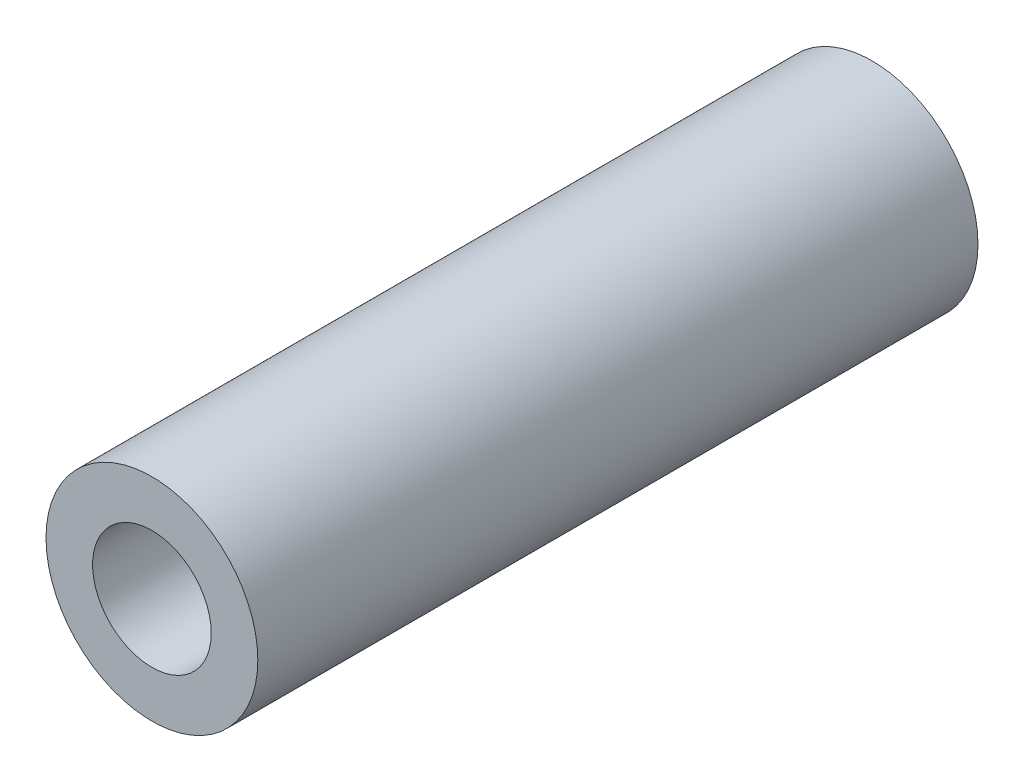
ISO-10303-21;
HEADER;
FILE_DESCRIPTION(('STEP AP214'),'2;1');
FILE_NAME('part.step','',(''),(''),'','','');
FILE_SCHEMA(('AUTOMOTIVE_DESIGN { 1 0 10303 214 1 1 1 1 }'));
ENDSEC;
DATA;
#1=APPLICATION_CONTEXT('core data for automotive mechanical design processes');
#2=APPLICATION_PROTOCOL_DEFINITION('international standard','automotive_design',2000,#1);
#3=PRODUCT_CONTEXT('',#1,'mechanical');
#4=PRODUCT('Part','Part','',(#3));
#5=PRODUCT_RELATED_PRODUCT_CATEGORY('part','',(#4));
#6=PRODUCT_DEFINITION_FORMATION('','',#4);
#7=PRODUCT_DEFINITION_CONTEXT('part definition',#1,'design');
#8=PRODUCT_DEFINITION('design','',#6,#7);
#9=PRODUCT_DEFINITION_SHAPE('','',#8);
#10=(LENGTH_UNIT() NAMED_UNIT(*) SI_UNIT(.MILLI.,.METRE.));
#11=(NAMED_UNIT(*) PLANE_ANGLE_UNIT() SI_UNIT($,.RADIAN.));
#12=(NAMED_UNIT(*) SI_UNIT($,.STERADIAN.) SOLID_ANGLE_UNIT());
#13=UNCERTAINTY_MEASURE_WITH_UNIT(LENGTH_MEASURE(1.E-05),#10,'distance_accuracy_value','');
#14=(GEOMETRIC_REPRESENTATION_CONTEXT(3) GLOBAL_UNCERTAINTY_ASSIGNED_CONTEXT((#13)) GLOBAL_UNIT_ASSIGNED_CONTEXT((#10,
#11,#12)) REPRESENTATION_CONTEXT('',''));
#15=CARTESIAN_POINT('',(0.,0.,0.));
#16=DIRECTION('',(0.,0.,1.));
#17=DIRECTION('',(1.,0.,0.));
#18=AXIS2_PLACEMENT_3D('',#15,#16,#17);
#19=CARTESIAN_POINT('',(100.,55.,139.));
#20=DIRECTION('',(0.,0.,1.));
#21=DIRECTION('',(1.,0.,0.));
#22=AXIS2_PLACEMENT_3D('',#19,#20,#21);
#23=CYLINDRICAL_SURFACE('',#22,2.8);
#24=DIRECTION('',(0.,0.,1.));
#25=VECTOR('',#24,1.);
#26=CARTESIAN_POINT('',(102.8,55.,139.));
#27=LINE('',#26,#25);
#28=CARTESIAN_POINT('',(102.8,55.,143.));
#29=VERTEX_POINT('',#28);
#30=CARTESIAN_POINT('',(102.8,55.,177.));
#31=VERTEX_POINT('',#30);
#32=EDGE_CURVE('E11',#29,#31,#27,.T.);
#33=ORIENTED_EDGE('',*,*,#32,.F.);
#34=CARTESIAN_POINT('',(100.,55.,143.));
#35=DIRECTION('',(0.,0.,1.));
#36=DIRECTION('',(1.,0.,0.));
#37=AXIS2_PLACEMENT_3D('',#34,#35,#36);
#38=CIRCLE('',#37,2.8);
#39=EDGE_CURVE('E24',#29,#29,#38,.T.);
#40=ORIENTED_EDGE('',*,*,#39,.F.);
#41=ORIENTED_EDGE('',*,*,#32,.T.);
#42=CARTESIAN_POINT('',(100.,55.,177.));
#43=DIRECTION('',(0.,0.,1.));
#44=DIRECTION('',(1.,0.,0.));
#45=AXIS2_PLACEMENT_3D('',#42,#43,#44);
#46=CIRCLE('',#45,2.8);
#47=EDGE_CURVE('E66',#31,#31,#46,.T.);
#48=ORIENTED_EDGE('',*,*,#47,.T.);
#49=EDGE_LOOP('',(#33,#40,#41,#48));
#50=FACE_BOUND('',#49,.T.);
#51=ADVANCED_FACE('F16',(#50),#23,.F.);
#52=CARTESIAN_POINT('',(100.,55.,143.));
#53=DIRECTION('',(0.,0.,1.));
#54=DIRECTION('',(1.,0.,0.));
#55=AXIS2_PLACEMENT_3D('',#52,#53,#54);
#56=PLANE('',#55);
#57=ORIENTED_EDGE('',*,*,#39,.T.);
#58=EDGE_LOOP('',(#57));
#59=FACE_BOUND('',#58,.T.);
#60=CARTESIAN_POINT('',(100.,55.,143.));
#61=DIRECTION('',(0.,0.,1.));
#62=DIRECTION('',(1.,0.,0.));
#63=AXIS2_PLACEMENT_3D('',#60,#61,#62);
#64=CIRCLE('',#63,5.);
#65=CARTESIAN_POINT('',(105.,55.,143.));
#66=VERTEX_POINT('',#65);
#67=EDGE_CURVE('E55',#66,#66,#64,.T.);
#68=ORIENTED_EDGE('',*,*,#67,.F.);
#69=EDGE_LOOP('',(#68));
#70=FACE_BOUND('',#69,.T.);
#71=ADVANCED_FACE('F71',(#59,#70),#56,.F.);
#72=CARTESIAN_POINT('',(100.,55.,177.));
#73=DIRECTION('',(0.,0.,1.));
#74=DIRECTION('',(1.,0.,0.));
#75=AXIS2_PLACEMENT_3D('',#72,#73,#74);
#76=PLANE('',#75);
#77=ORIENTED_EDGE('',*,*,#47,.F.);
#78=EDGE_LOOP('',(#77));
#79=FACE_BOUND('',#78,.T.);
#80=CARTESIAN_POINT('',(100.,55.,177.));
#81=DIRECTION('',(0.,0.,1.));
#82=DIRECTION('',(1.,0.,0.));
#83=AXIS2_PLACEMENT_3D('',#80,#81,#82);
#84=CIRCLE('',#83,5.);
#85=CARTESIAN_POINT('',(105.,55.,177.));
#86=VERTEX_POINT('',#85);
#87=EDGE_CURVE('E53',#86,#86,#84,.T.);
#88=ORIENTED_EDGE('',*,*,#87,.T.);
#89=EDGE_LOOP('',(#88));
#90=FACE_BOUND('',#89,.T.);
#91=ADVANCED_FACE('F59',(#79,#90),#76,.T.);
#92=CARTESIAN_POINT('',(100.,55.,143.));
#93=DIRECTION('',(0.,0.,1.));
#94=DIRECTION('',(1.,0.,0.));
#95=AXIS2_PLACEMENT_3D('',#92,#93,#94);
#96=CYLINDRICAL_SURFACE('',#95,5.);
#97=ORIENTED_EDGE('',*,*,#87,.F.);
#98=DIRECTION('',(0.,0.,1.));
#99=VECTOR('',#98,1.);
#100=CARTESIAN_POINT('',(105.,55.,143.));
#101=LINE('',#100,#99);
#102=EDGE_CURVE('E50',#66,#86,#101,.T.);
#103=ORIENTED_EDGE('',*,*,#102,.F.);
#104=ORIENTED_EDGE('',*,*,#67,.T.);
#105=ORIENTED_EDGE('',*,*,#102,.T.);
#106=EDGE_LOOP('',(#97,#103,#104,#105));
#107=FACE_BOUND('',#106,.T.);
#108=ADVANCED_FACE('F52',(#107),#96,.T.);
#109=CLOSED_SHELL('',(#51,#71,#91,#108));
#110=MANIFOLD_SOLID_BREP('B1',#109);
#111=ADVANCED_BREP_SHAPE_REPRESENTATION('',(#18,#110),#14);
#112=SHAPE_DEFINITION_REPRESENTATION(#9,#111);
ENDSEC;
END-ISO-10303-21;
